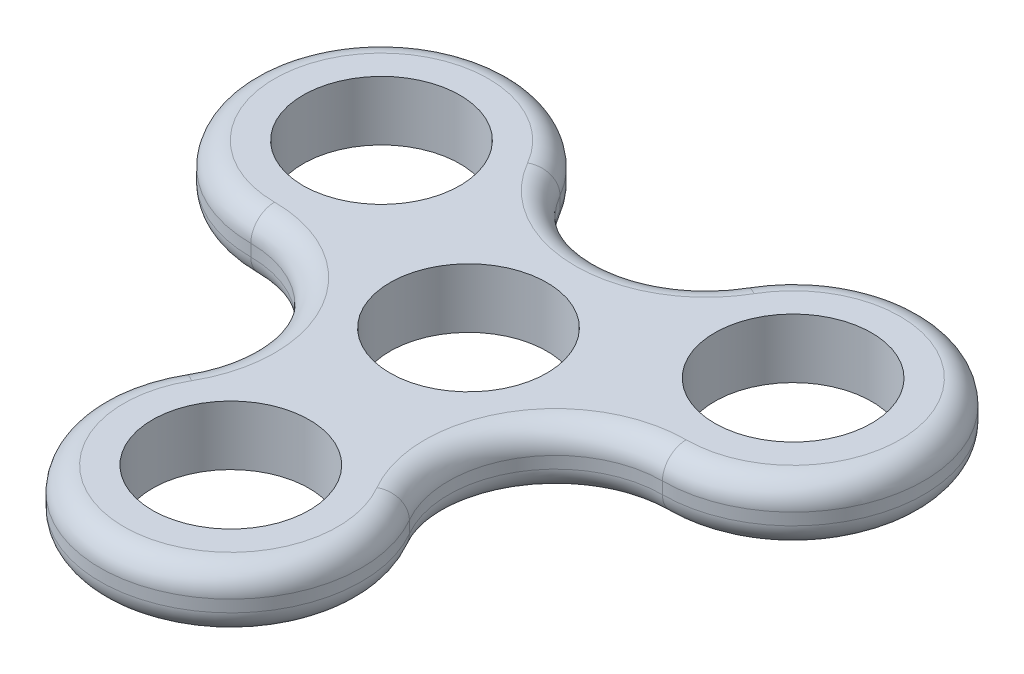
ISO-10303-21;
HEADER;
FILE_DESCRIPTION(('STEP AP214'),'2;1');
FILE_NAME('part.step','',(''),(''),'','','');
FILE_SCHEMA(('AUTOMOTIVE_DESIGN { 1 0 10303 214 1 1 1 1 }'));
ENDSEC;
DATA;
#1=APPLICATION_CONTEXT('core data for automotive mechanical design processes');
#2=APPLICATION_PROTOCOL_DEFINITION('international standard','automotive_design',2000,#1);
#3=PRODUCT_CONTEXT('',#1,'mechanical');
#4=PRODUCT('Part','Part','',(#3));
#5=PRODUCT_RELATED_PRODUCT_CATEGORY('part','',(#4));
#6=PRODUCT_DEFINITION_FORMATION('','',#4);
#7=PRODUCT_DEFINITION_CONTEXT('part definition',#1,'design');
#8=PRODUCT_DEFINITION('design','',#6,#7);
#9=PRODUCT_DEFINITION_SHAPE('','',#8);
#10=(LENGTH_UNIT() NAMED_UNIT(*) SI_UNIT(.MILLI.,.METRE.));
#11=(NAMED_UNIT(*) PLANE_ANGLE_UNIT() SI_UNIT($,.RADIAN.));
#12=(NAMED_UNIT(*) SI_UNIT($,.STERADIAN.) SOLID_ANGLE_UNIT());
#13=UNCERTAINTY_MEASURE_WITH_UNIT(LENGTH_MEASURE(1.E-05),#10,'distance_accuracy_value','');
#14=(GEOMETRIC_REPRESENTATION_CONTEXT(3) GLOBAL_UNCERTAINTY_ASSIGNED_CONTEXT((#13)) GLOBAL_UNIT_ASSIGNED_CONTEXT((#10,
#11,#12)) REPRESENTATION_CONTEXT('',''));
#15=CARTESIAN_POINT('',(0.,0.,0.));
#16=DIRECTION('',(0.,0.,1.));
#17=DIRECTION('',(1.,0.,0.));
#18=AXIS2_PLACEMENT_3D('',#15,#16,#17);
#19=CARTESIAN_POINT('',(8.66025403784441,5.,-15.));
#20=DIRECTION('',(0.,1.,0.));
#21=DIRECTION('',(0.,0.,1.));
#22=AXIS2_PLACEMENT_3D('',#19,#20,#21);
#23=PLANE('',#22);
#24=CARTESIAN_POINT('',(17.3205080756888,5.,9.99999999999995));
#25=DIRECTION('',(0.,1.,0.));
#26=DIRECTION('',(0.,0.,1.));
#27=AXIS2_PLACEMENT_3D('',#24,#25,#26);
#28=CIRCLE('',#27,10.9999999999999);
#29=CARTESIAN_POINT('',(7.79422863406009,5.,15.4999999999999));
#30=VERTEX_POINT('',#29);
#31=CARTESIAN_POINT('',(17.3205080756888,5.,-0.999999999999919));
#32=VERTEX_POINT('',#31);
#33=EDGE_CURVE('E149',#30,#32,#28,.F.);
#34=ORIENTED_EDGE('',*,*,#33,.T.);
#35=CARTESIAN_POINT('',(17.3205080756887,5.,-10.0000000000001));
#36=DIRECTION('',(0.,1.,0.));
#37=DIRECTION('',(0.,0.,1.));
#38=AXIS2_PLACEMENT_3D('',#35,#36,#37);
#39=CIRCLE('',#38,9.);
#40=CARTESIAN_POINT('',(9.5262794416289,5.,-14.5));
#41=VERTEX_POINT('',#40);
#42=EDGE_CURVE('E130',#32,#41,#39,.T.);
#43=ORIENTED_EDGE('',*,*,#42,.T.);
#44=CARTESIAN_POINT('',(0.,5.,-20.));
#45=DIRECTION('',(0.,1.,0.));
#46=DIRECTION('',(0.,0.,1.));
#47=AXIS2_PLACEMENT_3D('',#44,#45,#46);
#48=CIRCLE('',#47,11.);
#49=CARTESIAN_POINT('',(-9.52627944162872,5.,-14.5));
#50=VERTEX_POINT('',#49);
#51=EDGE_CURVE('E138',#41,#50,#48,.F.);
#52=ORIENTED_EDGE('',*,*,#51,.T.);
#53=CARTESIAN_POINT('',(-17.3205080756888,5.,-9.99999999999996));
#54=DIRECTION('',(0.,1.,0.));
#55=DIRECTION('',(0.,0.,1.));
#56=AXIS2_PLACEMENT_3D('',#53,#54,#55);
#57=CIRCLE('',#56,9.);
#58=CARTESIAN_POINT('',(-17.3205080756888,5.,-0.999999999999957));
#59=VERTEX_POINT('',#58);
#60=EDGE_CURVE('E144',#50,#59,#57,.T.);
#61=ORIENTED_EDGE('',*,*,#60,.T.);
#62=CARTESIAN_POINT('',(-17.3205080756887,5.,10.0000000000001));
#63=DIRECTION('',(0.,1.,0.));
#64=DIRECTION('',(0.,0.,1.));
#65=AXIS2_PLACEMENT_3D('',#62,#63,#64);
#66=CIRCLE('',#65,11.);
#67=CARTESIAN_POINT('',(-7.7942286340599,5.,15.5));
#68=VERTEX_POINT('',#67);
#69=EDGE_CURVE('E264',#59,#68,#66,.F.);
#70=ORIENTED_EDGE('',*,*,#69,.T.);
#71=CARTESIAN_POINT('',(0.,5.,20.));
#72=DIRECTION('',(0.,1.,0.));
#73=DIRECTION('',(0.,0.,1.));
#74=AXIS2_PLACEMENT_3D('',#71,#72,#73);
#75=CIRCLE('',#74,9.00000000000017);
#76=EDGE_CURVE('E155',#68,#30,#75,.T.);
#77=ORIENTED_EDGE('',*,*,#76,.T.);
#78=EDGE_LOOP('',(#34,#43,#52,#61,#70,#77));
#79=FACE_BOUND('',#78,.T.);
#80=CARTESIAN_POINT('',(17.3205080756887,5.,-10.0000000000001));
#81=DIRECTION('',(0.,1.,0.));
#82=DIRECTION('',(0.,0.,1.));
#83=AXIS2_PLACEMENT_3D('',#80,#81,#82);
#84=CIRCLE('',#83,6.6);
#85=CARTESIAN_POINT('',(17.3205080756887,5.,-3.40000000000009));
#86=VERTEX_POINT('',#85);
#87=EDGE_CURVE('E497',#86,#86,#84,.T.);
#88=ORIENTED_EDGE('',*,*,#87,.F.);
#89=EDGE_LOOP('',(#88));
#90=FACE_BOUND('',#89,.T.);
#91=CARTESIAN_POINT('',(0.,5.,0.));
#92=DIRECTION('',(0.,1.,0.));
#93=DIRECTION('',(0.,0.,1.));
#94=AXIS2_PLACEMENT_3D('',#91,#92,#93);
#95=CIRCLE('',#94,6.6);
#96=CARTESIAN_POINT('',(0.,5.,6.6));
#97=VERTEX_POINT('',#96);
#98=EDGE_CURVE('E245',#97,#97,#95,.T.);
#99=ORIENTED_EDGE('',*,*,#98,.F.);
#100=EDGE_LOOP('',(#99));
#101=FACE_BOUND('',#100,.T.);
#102=CARTESIAN_POINT('',(0.,5.,20.));
#103=DIRECTION('',(0.,1.,0.));
#104=DIRECTION('',(0.,0.,1.));
#105=AXIS2_PLACEMENT_3D('',#102,#103,#104);
#106=CIRCLE('',#105,6.6);
#107=CARTESIAN_POINT('',(0.,5.,26.6));
#108=VERTEX_POINT('',#107);
#109=EDGE_CURVE('E491',#108,#108,#106,.T.);
#110=ORIENTED_EDGE('',*,*,#109,.F.);
#111=EDGE_LOOP('',(#110));
#112=FACE_BOUND('',#111,.T.);
#113=CARTESIAN_POINT('',(-17.3205080756888,5.,-9.99999999999996));
#114=DIRECTION('',(0.,1.,0.));
#115=DIRECTION('',(0.,0.,1.));
#116=AXIS2_PLACEMENT_3D('',#113,#114,#115);
#117=CIRCLE('',#116,6.6);
#118=CARTESIAN_POINT('',(-17.3205080756888,5.,-3.39999999999996));
#119=VERTEX_POINT('',#118);
#120=EDGE_CURVE('E503',#119,#119,#117,.T.);
#121=ORIENTED_EDGE('',*,*,#120,.F.);
#122=EDGE_LOOP('',(#121));
#123=FACE_BOUND('',#122,.T.);
#124=ADVANCED_FACE('F33',(#79,#90,#101,#112,#123),#23,.T.);
#125=CARTESIAN_POINT('',(8.66025403784441,0.,-15.));
#126=DIRECTION('',(0.,1.,0.));
#127=DIRECTION('',(0.,0.,1.));
#128=AXIS2_PLACEMENT_3D('',#125,#126,#127);
#129=PLANE('',#128);
#130=CARTESIAN_POINT('',(0.,0.,-20.));
#131=DIRECTION('',(0.,1.,0.));
#132=DIRECTION('',(0.,0.,1.));
#133=AXIS2_PLACEMENT_3D('',#130,#131,#132);
#134=CIRCLE('',#133,11.);
#135=CARTESIAN_POINT('',(-9.52627944162872,0.,-14.5));
#136=VERTEX_POINT('',#135);
#137=CARTESIAN_POINT('',(9.5262794416289,0.,-14.5));
#138=VERTEX_POINT('',#137);
#139=EDGE_CURVE('E176',#136,#138,#134,.T.);
#140=ORIENTED_EDGE('',*,*,#139,.T.);
#141=CARTESIAN_POINT('',(17.3205080756887,0.,-10.0000000000001));
#142=DIRECTION('',(0.,1.,0.));
#143=DIRECTION('',(0.,0.,1.));
#144=AXIS2_PLACEMENT_3D('',#141,#142,#143);
#145=CIRCLE('',#144,9.);
#146=CARTESIAN_POINT('',(17.3205080756888,0.,-0.999999999999919));
#147=VERTEX_POINT('',#146);
#148=EDGE_CURVE('E185',#138,#147,#145,.F.);
#149=ORIENTED_EDGE('',*,*,#148,.T.);
#150=CARTESIAN_POINT('',(17.3205080756888,0.,9.99999999999995));
#151=DIRECTION('',(0.,1.,0.));
#152=DIRECTION('',(0.,0.,1.));
#153=AXIS2_PLACEMENT_3D('',#150,#151,#152);
#154=CIRCLE('',#153,10.9999999999999);
#155=CARTESIAN_POINT('',(7.79422863406009,0.,15.4999999999999));
#156=VERTEX_POINT('',#155);
#157=EDGE_CURVE('E57',#147,#156,#154,.T.);
#158=ORIENTED_EDGE('',*,*,#157,.T.);
#159=CARTESIAN_POINT('',(0.,0.,20.));
#160=DIRECTION('',(0.,1.,0.));
#161=DIRECTION('',(0.,0.,1.));
#162=AXIS2_PLACEMENT_3D('',#159,#160,#161);
#163=CIRCLE('',#162,9.00000000000017);
#164=CARTESIAN_POINT('',(-7.7942286340599,0.,15.5));
#165=VERTEX_POINT('',#164);
#166=EDGE_CURVE('E182',#156,#165,#163,.F.);
#167=ORIENTED_EDGE('',*,*,#166,.T.);
#168=CARTESIAN_POINT('',(-17.3205080756887,0.,10.0000000000001));
#169=DIRECTION('',(0.,1.,0.));
#170=DIRECTION('',(0.,0.,1.));
#171=AXIS2_PLACEMENT_3D('',#168,#169,#170);
#172=CIRCLE('',#171,11.);
#173=CARTESIAN_POINT('',(-17.3205080756888,0.,-0.999999999999957));
#174=VERTEX_POINT('',#173);
#175=EDGE_CURVE('E180',#165,#174,#172,.T.);
#176=ORIENTED_EDGE('',*,*,#175,.T.);
#177=CARTESIAN_POINT('',(-17.3205080756888,0.,-9.99999999999996));
#178=DIRECTION('',(0.,1.,0.));
#179=DIRECTION('',(0.,0.,1.));
#180=AXIS2_PLACEMENT_3D('',#177,#178,#179);
#181=CIRCLE('',#180,9.);
#182=EDGE_CURVE('E178',#174,#136,#181,.F.);
#183=ORIENTED_EDGE('',*,*,#182,.T.);
#184=EDGE_LOOP('',(#140,#149,#158,#167,#176,#183));
#185=FACE_BOUND('',#184,.T.);
#186=CARTESIAN_POINT('',(0.,0.,0.));
#187=DIRECTION('',(0.,1.,0.));
#188=DIRECTION('',(0.,0.,1.));
#189=AXIS2_PLACEMENT_3D('',#186,#187,#188);
#190=CIRCLE('',#189,6.6);
#191=CARTESIAN_POINT('',(0.,0.,6.6));
#192=VERTEX_POINT('',#191);
#193=EDGE_CURVE('E250',#192,#192,#190,.T.);
#194=ORIENTED_EDGE('',*,*,#193,.T.);
#195=EDGE_LOOP('',(#194));
#196=FACE_BOUND('',#195,.T.);
#197=CARTESIAN_POINT('',(0.,0.,20.));
#198=DIRECTION('',(0.,1.,0.));
#199=DIRECTION('',(0.,0.,1.));
#200=AXIS2_PLACEMENT_3D('',#197,#198,#199);
#201=CIRCLE('',#200,6.6);
#202=CARTESIAN_POINT('',(0.,0.,26.6));
#203=VERTEX_POINT('',#202);
#204=EDGE_CURVE('E493',#203,#203,#201,.T.);
#205=ORIENTED_EDGE('',*,*,#204,.T.);
#206=EDGE_LOOP('',(#205));
#207=FACE_BOUND('',#206,.T.);
#208=CARTESIAN_POINT('',(17.3205080756887,0.,-10.0000000000001));
#209=DIRECTION('',(0.,1.,0.));
#210=DIRECTION('',(0.,0.,1.));
#211=AXIS2_PLACEMENT_3D('',#208,#209,#210);
#212=CIRCLE('',#211,6.6);
#213=CARTESIAN_POINT('',(17.3205080756887,0.,-3.40000000000009));
#214=VERTEX_POINT('',#213);
#215=EDGE_CURVE('E500',#214,#214,#212,.T.);
#216=ORIENTED_EDGE('',*,*,#215,.T.);
#217=EDGE_LOOP('',(#216));
#218=FACE_BOUND('',#217,.T.);
#219=CARTESIAN_POINT('',(-17.3205080756888,0.,-9.99999999999996));
#220=DIRECTION('',(0.,1.,0.));
#221=DIRECTION('',(0.,0.,1.));
#222=AXIS2_PLACEMENT_3D('',#219,#220,#221);
#223=CIRCLE('',#222,6.6);
#224=CARTESIAN_POINT('',(-17.3205080756888,0.,-3.39999999999996));
#225=VERTEX_POINT('',#224);
#226=EDGE_CURVE('E199',#225,#225,#223,.T.);
#227=ORIENTED_EDGE('',*,*,#226,.T.);
#228=EDGE_LOOP('',(#227));
#229=FACE_BOUND('',#228,.T.);
#230=ADVANCED_FACE('F223',(#185,#196,#207,#218,#229),#129,.F.);
#231=CARTESIAN_POINT('',(0.,5.,-20.));
#232=DIRECTION('',(0.,-1.,0.));
#233=DIRECTION('',(0.,0.,-1.));
#234=AXIS2_PLACEMENT_3D('',#231,#232,#233);
#235=CYLINDRICAL_SURFACE('',#234,8.99999999999998);
#236=DIRECTION('',(0.,-1.,0.));
#237=VECTOR('',#236,1.);
#238=CARTESIAN_POINT('',(-7.79422863405997,5.,-15.4999999999999));
#239=LINE('',#238,#237);
#240=CARTESIAN_POINT('',(-7.79422863405997,3.,-15.4999999999999));
#241=VERTEX_POINT('',#240);
#242=CARTESIAN_POINT('',(-7.79422863405997,2.,-15.4999999999999));
#243=VERTEX_POINT('',#242);
#244=EDGE_CURVE('E145',#241,#243,#239,.T.);
#245=ORIENTED_EDGE('',*,*,#244,.F.);
#246=CARTESIAN_POINT('',(0.,3.,-20.));
#247=DIRECTION('',(0.,1.,0.));
#248=DIRECTION('',(0.,0.,1.));
#249=AXIS2_PLACEMENT_3D('',#246,#247,#248);
#250=CIRCLE('',#249,8.99999999999998);
#251=CARTESIAN_POINT('',(7.79422863405989,3.,-15.5000000000001));
#252=VERTEX_POINT('',#251);
#253=EDGE_CURVE('E11',#241,#252,#250,.T.);
#254=ORIENTED_EDGE('',*,*,#253,.T.);
#255=DIRECTION('',(0.,-1.,0.));
#256=VECTOR('',#255,1.);
#257=CARTESIAN_POINT('',(7.79422863405989,5.,-15.5000000000001));
#258=LINE('',#257,#256);
#259=CARTESIAN_POINT('',(7.79422863405989,2.,-15.5000000000001));
#260=VERTEX_POINT('',#259);
#261=EDGE_CURVE('E238',#252,#260,#258,.T.);
#262=ORIENTED_EDGE('',*,*,#261,.T.);
#263=CARTESIAN_POINT('',(0.,2.,-20.));
#264=DIRECTION('',(0.,1.,0.));
#265=DIRECTION('',(0.,0.,1.));
#266=AXIS2_PLACEMENT_3D('',#263,#264,#265);
#267=CIRCLE('',#266,8.99999999999998);
#268=EDGE_CURVE('E42',#260,#243,#267,.F.);
#269=ORIENTED_EDGE('',*,*,#268,.T.);
#270=EDGE_LOOP('',(#245,#254,#262,#269));
#271=FACE_BOUND('',#270,.T.);
#272=ADVANCED_FACE('F243',(#271),#235,.F.);
#273=CARTESIAN_POINT('',(-17.3205080756888,5.,-9.99999999999996));
#274=DIRECTION('',(0.,-1.,0.));
#275=DIRECTION('',(0.,0.,-1.));
#276=AXIS2_PLACEMENT_3D('',#273,#274,#275);
#277=CYLINDRICAL_SURFACE('',#276,11.);
#278=DIRECTION('',(0.,-1.,0.));
#279=VECTOR('',#278,1.);
#280=CARTESIAN_POINT('',(-17.3205080756888,5.,1.00000000000004));
#281=LINE('',#280,#279);
#282=CARTESIAN_POINT('',(-17.3205080756888,3.,1.00000000000004));
#283=VERTEX_POINT('',#282);
#284=CARTESIAN_POINT('',(-17.3205080756888,2.,1.00000000000004));
#285=VERTEX_POINT('',#284);
#286=EDGE_CURVE('E259',#283,#285,#281,.T.);
#287=ORIENTED_EDGE('',*,*,#286,.F.);
#288=CARTESIAN_POINT('',(-17.3205080756888,3.,-9.99999999999996));
#289=DIRECTION('',(0.,1.,0.));
#290=DIRECTION('',(0.,0.,1.));
#291=AXIS2_PLACEMENT_3D('',#288,#289,#290);
#292=CIRCLE('',#291,11.);
#293=EDGE_CURVE('E174',#283,#241,#292,.F.);
#294=ORIENTED_EDGE('',*,*,#293,.T.);
#295=ORIENTED_EDGE('',*,*,#244,.T.);
#296=CARTESIAN_POINT('',(-17.3205080756888,2.,-9.99999999999996));
#297=DIRECTION('',(0.,1.,0.));
#298=DIRECTION('',(0.,0.,1.));
#299=AXIS2_PLACEMENT_3D('',#296,#297,#298);
#300=CIRCLE('',#299,11.);
#301=EDGE_CURVE('E172',#243,#285,#300,.T.);
#302=ORIENTED_EDGE('',*,*,#301,.T.);
#303=EDGE_LOOP('',(#287,#294,#295,#302));
#304=FACE_BOUND('',#303,.T.);
#305=ADVANCED_FACE('F310',(#304),#277,.T.);
#306=CARTESIAN_POINT('',(-17.3205080756887,5.,10.0000000000001));
#307=DIRECTION('',(0.,-1.,0.));
#308=DIRECTION('',(0.,0.,-1.));
#309=AXIS2_PLACEMENT_3D('',#306,#307,#308);
#310=CYLINDRICAL_SURFACE('',#309,8.99999999999998);
#311=DIRECTION('',(0.,-1.,0.));
#312=VECTOR('',#311,1.);
#313=CARTESIAN_POINT('',(-9.52627944162878,5.,14.5000000000001));
#314=LINE('',#313,#312);
#315=CARTESIAN_POINT('',(-9.52627944162878,3.,14.5000000000001));
#316=VERTEX_POINT('',#315);
#317=CARTESIAN_POINT('',(-9.52627944162878,2.,14.5000000000001));
#318=VERTEX_POINT('',#317);
#319=EDGE_CURVE('E256',#316,#318,#314,.T.);
#320=ORIENTED_EDGE('',*,*,#319,.F.);
#321=CARTESIAN_POINT('',(-17.3205080756887,3.,10.0000000000001));
#322=DIRECTION('',(0.,1.,0.));
#323=DIRECTION('',(0.,0.,1.));
#324=AXIS2_PLACEMENT_3D('',#321,#322,#323);
#325=CIRCLE('',#324,8.99999999999998);
#326=EDGE_CURVE('E170',#316,#283,#325,.T.);
#327=ORIENTED_EDGE('',*,*,#326,.T.);
#328=ORIENTED_EDGE('',*,*,#286,.T.);
#329=CARTESIAN_POINT('',(-17.3205080756887,2.,10.0000000000001));
#330=DIRECTION('',(0.,1.,0.));
#331=DIRECTION('',(0.,0.,1.));
#332=AXIS2_PLACEMENT_3D('',#329,#330,#331);
#333=CIRCLE('',#332,8.99999999999998);
#334=EDGE_CURVE('E168',#285,#318,#333,.F.);
#335=ORIENTED_EDGE('',*,*,#334,.T.);
#336=EDGE_LOOP('',(#320,#327,#328,#335));
#337=FACE_BOUND('',#336,.T.);
#338=ADVANCED_FACE('F306',(#337),#310,.F.);
#339=CARTESIAN_POINT('',(0.,5.,20.));
#340=DIRECTION('',(0.,-1.,0.));
#341=DIRECTION('',(0.,0.,-1.));
#342=AXIS2_PLACEMENT_3D('',#339,#340,#341);
#343=CYLINDRICAL_SURFACE('',#342,11.0000000000002);
#344=DIRECTION('',(0.,-1.,0.));
#345=VECTOR('',#344,1.);
#346=CARTESIAN_POINT('',(9.52627944162897,5.,14.4999999999999));
#347=LINE('',#346,#345);
#348=CARTESIAN_POINT('',(9.52627944162897,3.,14.4999999999999));
#349=VERTEX_POINT('',#348);
#350=CARTESIAN_POINT('',(9.52627944162897,2.,14.4999999999999));
#351=VERTEX_POINT('',#350);
#352=EDGE_CURVE('E247',#349,#351,#347,.T.);
#353=ORIENTED_EDGE('',*,*,#352,.F.);
#354=CARTESIAN_POINT('',(0.,3.,20.));
#355=DIRECTION('',(0.,1.,0.));
#356=DIRECTION('',(0.,0.,1.));
#357=AXIS2_PLACEMENT_3D('',#354,#355,#356);
#358=CIRCLE('',#357,11.0000000000002);
#359=EDGE_CURVE('E166',#349,#316,#358,.F.);
#360=ORIENTED_EDGE('',*,*,#359,.T.);
#361=ORIENTED_EDGE('',*,*,#319,.T.);
#362=CARTESIAN_POINT('',(0.,2.,20.));
#363=DIRECTION('',(0.,1.,0.));
#364=DIRECTION('',(0.,0.,1.));
#365=AXIS2_PLACEMENT_3D('',#362,#363,#364);
#366=CIRCLE('',#365,11.0000000000002);
#367=EDGE_CURVE('E164',#318,#351,#366,.T.);
#368=ORIENTED_EDGE('',*,*,#367,.T.);
#369=EDGE_LOOP('',(#353,#360,#361,#368));
#370=FACE_BOUND('',#369,.T.);
#371=ADVANCED_FACE('F303',(#370),#343,.T.);
#372=CARTESIAN_POINT('',(17.3205080756888,5.,9.99999999999995));
#373=DIRECTION('',(0.,-1.,0.));
#374=DIRECTION('',(0.,0.,-1.));
#375=AXIS2_PLACEMENT_3D('',#372,#373,#374);
#376=CYLINDRICAL_SURFACE('',#375,8.99999999999987);
#377=DIRECTION('',(0.,-1.,0.));
#378=VECTOR('',#377,1.);
#379=CARTESIAN_POINT('',(17.3205080756888,5.,1.00000000000008));
#380=LINE('',#379,#378);
#381=CARTESIAN_POINT('',(17.3205080756888,3.,1.00000000000008));
#382=VERTEX_POINT('',#381);
#383=CARTESIAN_POINT('',(17.3205080756888,2.,1.00000000000008));
#384=VERTEX_POINT('',#383);
#385=EDGE_CURVE('E240',#382,#384,#380,.T.);
#386=ORIENTED_EDGE('',*,*,#385,.F.);
#387=CARTESIAN_POINT('',(17.3205080756888,3.,9.99999999999995));
#388=DIRECTION('',(0.,1.,0.));
#389=DIRECTION('',(0.,0.,1.));
#390=AXIS2_PLACEMENT_3D('',#387,#388,#389);
#391=CIRCLE('',#390,8.99999999999987);
#392=EDGE_CURVE('E162',#382,#349,#391,.T.);
#393=ORIENTED_EDGE('',*,*,#392,.T.);
#394=ORIENTED_EDGE('',*,*,#352,.T.);
#395=CARTESIAN_POINT('',(17.3205080756888,2.,9.99999999999995));
#396=DIRECTION('',(0.,1.,0.));
#397=DIRECTION('',(0.,0.,1.));
#398=AXIS2_PLACEMENT_3D('',#395,#396,#397);
#399=CIRCLE('',#398,8.99999999999987);
#400=EDGE_CURVE('E160',#351,#384,#399,.F.);
#401=ORIENTED_EDGE('',*,*,#400,.T.);
#402=EDGE_LOOP('',(#386,#393,#394,#401));
#403=FACE_BOUND('',#402,.T.);
#404=ADVANCED_FACE('F277',(#403),#376,.F.);
#405=CARTESIAN_POINT('',(17.3205080756887,5.,-10.0000000000001));
#406=DIRECTION('',(0.,-1.,0.));
#407=DIRECTION('',(0.,0.,-1.));
#408=AXIS2_PLACEMENT_3D('',#405,#406,#407);
#409=CYLINDRICAL_SURFACE('',#408,11.);
#410=ORIENTED_EDGE('',*,*,#261,.F.);
#411=CARTESIAN_POINT('',(17.3205080756887,3.,-10.0000000000001));
#412=DIRECTION('',(0.,1.,0.));
#413=DIRECTION('',(0.,0.,1.));
#414=AXIS2_PLACEMENT_3D('',#411,#412,#413);
#415=CIRCLE('',#414,11.);
#416=EDGE_CURVE('E132',#252,#382,#415,.F.);
#417=ORIENTED_EDGE('',*,*,#416,.T.);
#418=ORIENTED_EDGE('',*,*,#385,.T.);
#419=CARTESIAN_POINT('',(17.3205080756887,2.,-10.0000000000001));
#420=DIRECTION('',(0.,1.,0.));
#421=DIRECTION('',(0.,0.,1.));
#422=AXIS2_PLACEMENT_3D('',#419,#420,#421);
#423=CIRCLE('',#422,11.);
#424=EDGE_CURVE('E151',#384,#260,#423,.T.);
#425=ORIENTED_EDGE('',*,*,#424,.T.);
#426=EDGE_LOOP('',(#410,#417,#418,#425));
#427=FACE_BOUND('',#426,.T.);
#428=ADVANCED_FACE('F237',(#427),#409,.T.);
#429=CARTESIAN_POINT('',(0.,5.,0.));
#430=DIRECTION('',(0.,-1.,0.));
#431=DIRECTION('',(0.,0.,-1.));
#432=AXIS2_PLACEMENT_3D('',#429,#430,#431);
#433=CYLINDRICAL_SURFACE('',#432,6.6);
#434=ORIENTED_EDGE('',*,*,#98,.T.);
#435=EDGE_LOOP('',(#434));
#436=FACE_BOUND('',#435,.T.);
#437=ORIENTED_EDGE('',*,*,#193,.F.);
#438=EDGE_LOOP('',(#437));
#439=FACE_BOUND('',#438,.T.);
#440=ADVANCED_FACE('F296',(#436,#439),#433,.F.);
#441=CARTESIAN_POINT('',(0.,5.,20.));
#442=DIRECTION('',(0.,-1.,0.));
#443=DIRECTION('',(0.,0.,-1.));
#444=AXIS2_PLACEMENT_3D('',#441,#442,#443);
#445=CYLINDRICAL_SURFACE('',#444,6.6);
#446=ORIENTED_EDGE('',*,*,#109,.T.);
#447=EDGE_LOOP('',(#446));
#448=FACE_BOUND('',#447,.T.);
#449=ORIENTED_EDGE('',*,*,#204,.F.);
#450=EDGE_LOOP('',(#449));
#451=FACE_BOUND('',#450,.T.);
#452=ADVANCED_FACE('F468',(#448,#451),#445,.F.);
#453=CARTESIAN_POINT('',(17.3205080756887,5.,-10.0000000000001));
#454=DIRECTION('',(0.,-1.,0.));
#455=DIRECTION('',(0.,0.,-1.));
#456=AXIS2_PLACEMENT_3D('',#453,#454,#455);
#457=CYLINDRICAL_SURFACE('',#456,6.6);
#458=ORIENTED_EDGE('',*,*,#87,.T.);
#459=EDGE_LOOP('',(#458));
#460=FACE_BOUND('',#459,.T.);
#461=ORIENTED_EDGE('',*,*,#215,.F.);
#462=EDGE_LOOP('',(#461));
#463=FACE_BOUND('',#462,.T.);
#464=ADVANCED_FACE('F458',(#460,#463),#457,.F.);
#465=CARTESIAN_POINT('',(-17.3205080756888,5.,-9.99999999999996));
#466=DIRECTION('',(0.,-1.,0.));
#467=DIRECTION('',(0.,0.,-1.));
#468=AXIS2_PLACEMENT_3D('',#465,#466,#467);
#469=CYLINDRICAL_SURFACE('',#468,6.6);
#470=ORIENTED_EDGE('',*,*,#120,.T.);
#471=EDGE_LOOP('',(#470));
#472=FACE_BOUND('',#471,.T.);
#473=ORIENTED_EDGE('',*,*,#226,.F.);
#474=EDGE_LOOP('',(#473));
#475=FACE_BOUND('',#474,.T.);
#476=ADVANCED_FACE('F332',(#472,#475),#469,.F.);
#477=CARTESIAN_POINT('',(-17.3205080756887,3.,10.0000000000001));
#478=DIRECTION('',(0.,1.,0.));
#479=DIRECTION('',(0.,0.,1.));
#480=AXIS2_PLACEMENT_3D('',#477,#478,#479);
#481=TOROIDAL_SURFACE('',#480,11.,2.);
#482=CARTESIAN_POINT('',(-17.3205080756888,3.,-0.999999999999895));
#483=DIRECTION('',(-1.,0.,0.));
#484=DIRECTION('',(0.,0.,1.));
#485=AXIS2_PLACEMENT_3D('',#482,#483,#484);
#486=CIRCLE('',#485,2.);
#487=EDGE_CURVE('E193',#283,#59,#486,.T.);
#488=ORIENTED_EDGE('',*,*,#487,.F.);
#489=ORIENTED_EDGE('',*,*,#326,.F.);
#490=CARTESIAN_POINT('',(-7.7942286340599,3.,15.5));
#491=DIRECTION('',(-0.499999999999998,0.,0.86602540378444));
#492=DIRECTION('',(0.86602540378444,0.,0.499999999999998));
#493=AXIS2_PLACEMENT_3D('',#490,#491,#492);
#494=CIRCLE('',#493,2.);
#495=EDGE_CURVE('E196',#68,#316,#494,.T.);
#496=ORIENTED_EDGE('',*,*,#495,.F.);
#497=ORIENTED_EDGE('',*,*,#69,.F.);
#498=EDGE_LOOP('',(#488,#489,#496,#497));
#499=FACE_BOUND('',#498,.T.);
#500=ADVANCED_FACE('F329',(#499),#481,.T.);
#501=CARTESIAN_POINT('',(0.,3.,20.));
#502=DIRECTION('',(0.,1.,0.));
#503=DIRECTION('',(0.,0.,1.));
#504=AXIS2_PLACEMENT_3D('',#501,#502,#503);
#505=TOROIDAL_SURFACE('',#504,9.00000000000017,2.);
#506=ORIENTED_EDGE('',*,*,#495,.T.);
#507=ORIENTED_EDGE('',*,*,#359,.F.);
#508=CARTESIAN_POINT('',(7.79422863406009,3.,15.4999999999999));
#509=DIRECTION('',(-0.500000000000001,0.,-0.866025403784438));
#510=DIRECTION('',(-0.866025403784438,0.,0.500000000000001));
#511=AXIS2_PLACEMENT_3D('',#508,#509,#510);
#512=CIRCLE('',#511,2.);
#513=EDGE_CURVE('E190',#30,#349,#512,.T.);
#514=ORIENTED_EDGE('',*,*,#513,.F.);
#515=ORIENTED_EDGE('',*,*,#76,.F.);
#516=EDGE_LOOP('',(#506,#507,#514,#515));
#517=FACE_BOUND('',#516,.T.);
#518=ADVANCED_FACE('F271',(#517),#505,.T.);
#519=CARTESIAN_POINT('',(-17.3205080756888,3.,-9.99999999999996));
#520=DIRECTION('',(0.,1.,0.));
#521=DIRECTION('',(0.,0.,1.));
#522=AXIS2_PLACEMENT_3D('',#519,#520,#521);
#523=TOROIDAL_SURFACE('',#522,9.,2.);
#524=ORIENTED_EDGE('',*,*,#487,.T.);
#525=ORIENTED_EDGE('',*,*,#60,.F.);
#526=CARTESIAN_POINT('',(-9.52627944162884,3.,-14.4999999999999));
#527=DIRECTION('',(0.499999999999999,0.,0.866025403784439));
#528=DIRECTION('',(0.866025403784439,0.,-0.499999999999999));
#529=AXIS2_PLACEMENT_3D('',#526,#527,#528);
#530=CIRCLE('',#529,2.);
#531=EDGE_CURVE('E141',#241,#50,#530,.T.);
#532=ORIENTED_EDGE('',*,*,#531,.F.);
#533=ORIENTED_EDGE('',*,*,#293,.F.);
#534=EDGE_LOOP('',(#524,#525,#532,#533));
#535=FACE_BOUND('',#534,.T.);
#536=ADVANCED_FACE('F323',(#535),#523,.T.);
#537=CARTESIAN_POINT('',(17.3205080756888,3.,9.99999999999995));
#538=DIRECTION('',(0.,1.,0.));
#539=DIRECTION('',(0.,0.,1.));
#540=AXIS2_PLACEMENT_3D('',#537,#538,#539);
#541=TOROIDAL_SURFACE('',#540,10.9999999999999,2.);
#542=ORIENTED_EDGE('',*,*,#513,.T.);
#543=ORIENTED_EDGE('',*,*,#392,.F.);
#544=CARTESIAN_POINT('',(17.3205080756888,3.,-0.999999999999919));
#545=DIRECTION('',(1.,0.,0.));
#546=DIRECTION('',(0.,0.,-1.));
#547=AXIS2_PLACEMENT_3D('',#544,#545,#546);
#548=CIRCLE('',#547,2.);
#549=EDGE_CURVE('E135',#32,#382,#548,.T.);
#550=ORIENTED_EDGE('',*,*,#549,.F.);
#551=ORIENTED_EDGE('',*,*,#33,.F.);
#552=EDGE_LOOP('',(#542,#543,#550,#551));
#553=FACE_BOUND('',#552,.T.);
#554=ADVANCED_FACE('F274',(#553),#541,.T.);
#555=CARTESIAN_POINT('',(0.,3.,-20.));
#556=DIRECTION('',(0.,1.,0.));
#557=DIRECTION('',(0.,0.,1.));
#558=AXIS2_PLACEMENT_3D('',#555,#556,#557);
#559=TOROIDAL_SURFACE('',#558,11.,2.);
#560=ORIENTED_EDGE('',*,*,#531,.T.);
#561=ORIENTED_EDGE('',*,*,#51,.F.);
#562=CARTESIAN_POINT('',(9.5262794416289,3.,-14.5));
#563=DIRECTION('',(0.5,0.,-0.866025403784438));
#564=DIRECTION('',(-0.866025403784438,0.,-0.5));
#565=AXIS2_PLACEMENT_3D('',#562,#563,#564);
#566=CIRCLE('',#565,2.);
#567=EDGE_CURVE('E126',#252,#41,#566,.T.);
#568=ORIENTED_EDGE('',*,*,#567,.F.);
#569=ORIENTED_EDGE('',*,*,#253,.F.);
#570=EDGE_LOOP('',(#560,#561,#568,#569));
#571=FACE_BOUND('',#570,.T.);
#572=ADVANCED_FACE('F139',(#571),#559,.T.);
#573=CARTESIAN_POINT('',(17.3205080756887,3.,-10.0000000000001));
#574=DIRECTION('',(0.,1.,0.));
#575=DIRECTION('',(0.,0.,1.));
#576=AXIS2_PLACEMENT_3D('',#573,#574,#575);
#577=TOROIDAL_SURFACE('',#576,9.,2.);
#578=ORIENTED_EDGE('',*,*,#549,.T.);
#579=ORIENTED_EDGE('',*,*,#416,.F.);
#580=ORIENTED_EDGE('',*,*,#567,.T.);
#581=ORIENTED_EDGE('',*,*,#42,.F.);
#582=EDGE_LOOP('',(#578,#579,#580,#581));
#583=FACE_BOUND('',#582,.T.);
#584=ADVANCED_FACE('F128',(#583),#577,.T.);
#585=CARTESIAN_POINT('',(-17.3205080756887,2.,10.0000000000001));
#586=DIRECTION('',(0.,1.,0.));
#587=DIRECTION('',(0.,0.,1.));
#588=AXIS2_PLACEMENT_3D('',#585,#586,#587);
#589=TOROIDAL_SURFACE('',#588,11.,2.);
#590=CARTESIAN_POINT('',(-17.3205080756888,2.,-0.999999999999895));
#591=DIRECTION('',(-1.,0.,0.));
#592=DIRECTION('',(0.,0.,1.));
#593=AXIS2_PLACEMENT_3D('',#590,#591,#592);
#594=CIRCLE('',#593,2.);
#595=EDGE_CURVE('E208',#174,#285,#594,.T.);
#596=ORIENTED_EDGE('',*,*,#595,.F.);
#597=ORIENTED_EDGE('',*,*,#175,.F.);
#598=CARTESIAN_POINT('',(-7.7942286340599,2.,15.5));
#599=DIRECTION('',(-0.499999999999998,0.,0.86602540378444));
#600=DIRECTION('',(0.86602540378444,0.,0.499999999999998));
#601=AXIS2_PLACEMENT_3D('',#598,#599,#600);
#602=CIRCLE('',#601,2.);
#603=EDGE_CURVE('E37',#318,#165,#602,.T.);
#604=ORIENTED_EDGE('',*,*,#603,.F.);
#605=ORIENTED_EDGE('',*,*,#334,.F.);
#606=EDGE_LOOP('',(#596,#597,#604,#605));
#607=FACE_BOUND('',#606,.T.);
#608=ADVANCED_FACE('F35',(#607),#589,.T.);
#609=CARTESIAN_POINT('',(0.,2.,20.));
#610=DIRECTION('',(0.,1.,0.));
#611=DIRECTION('',(0.,0.,1.));
#612=AXIS2_PLACEMENT_3D('',#609,#610,#611);
#613=TOROIDAL_SURFACE('',#612,9.00000000000017,2.);
#614=ORIENTED_EDGE('',*,*,#603,.T.);
#615=ORIENTED_EDGE('',*,*,#166,.F.);
#616=CARTESIAN_POINT('',(7.79422863406009,2.,15.4999999999999));
#617=DIRECTION('',(-0.500000000000001,0.,-0.866025403784438));
#618=DIRECTION('',(-0.866025403784438,0.,0.500000000000001));
#619=AXIS2_PLACEMENT_3D('',#616,#617,#618);
#620=CIRCLE('',#619,2.);
#621=EDGE_CURVE('E206',#351,#156,#620,.T.);
#622=ORIENTED_EDGE('',*,*,#621,.F.);
#623=ORIENTED_EDGE('',*,*,#367,.F.);
#624=EDGE_LOOP('',(#614,#615,#622,#623));
#625=FACE_BOUND('',#624,.T.);
#626=ADVANCED_FACE('F218',(#625),#613,.T.);
#627=CARTESIAN_POINT('',(-17.3205080756888,2.,-9.99999999999996));
#628=DIRECTION('',(0.,1.,0.));
#629=DIRECTION('',(0.,0.,1.));
#630=AXIS2_PLACEMENT_3D('',#627,#628,#629);
#631=TOROIDAL_SURFACE('',#630,9.,2.);
#632=ORIENTED_EDGE('',*,*,#595,.T.);
#633=ORIENTED_EDGE('',*,*,#301,.F.);
#634=CARTESIAN_POINT('',(-9.52627944162884,2.,-14.4999999999999));
#635=DIRECTION('',(0.499999999999999,0.,0.866025403784439));
#636=DIRECTION('',(0.866025403784439,0.,-0.499999999999999));
#637=AXIS2_PLACEMENT_3D('',#634,#635,#636);
#638=CIRCLE('',#637,2.);
#639=EDGE_CURVE('E203',#136,#243,#638,.T.);
#640=ORIENTED_EDGE('',*,*,#639,.F.);
#641=ORIENTED_EDGE('',*,*,#182,.F.);
#642=EDGE_LOOP('',(#632,#633,#640,#641));
#643=FACE_BOUND('',#642,.T.);
#644=ADVANCED_FACE('F227',(#643),#631,.T.);
#645=CARTESIAN_POINT('',(17.3205080756888,2.,9.99999999999995));
#646=DIRECTION('',(0.,1.,0.));
#647=DIRECTION('',(0.,0.,1.));
#648=AXIS2_PLACEMENT_3D('',#645,#646,#647);
#649=TOROIDAL_SURFACE('',#648,10.9999999999999,2.);
#650=ORIENTED_EDGE('',*,*,#621,.T.);
#651=ORIENTED_EDGE('',*,*,#157,.F.);
#652=CARTESIAN_POINT('',(17.3205080756888,2.,-0.999999999999919));
#653=DIRECTION('',(1.,0.,0.));
#654=DIRECTION('',(0.,0.,-1.));
#655=AXIS2_PLACEMENT_3D('',#652,#653,#654);
#656=CIRCLE('',#655,2.);
#657=EDGE_CURVE('E50',#384,#147,#656,.T.);
#658=ORIENTED_EDGE('',*,*,#657,.F.);
#659=ORIENTED_EDGE('',*,*,#400,.F.);
#660=EDGE_LOOP('',(#650,#651,#658,#659));
#661=FACE_BOUND('',#660,.T.);
#662=ADVANCED_FACE('F280',(#661),#649,.T.);
#663=CARTESIAN_POINT('',(0.,2.,-20.));
#664=DIRECTION('',(0.,1.,0.));
#665=DIRECTION('',(0.,0.,1.));
#666=AXIS2_PLACEMENT_3D('',#663,#664,#665);
#667=TOROIDAL_SURFACE('',#666,11.,2.);
#668=ORIENTED_EDGE('',*,*,#639,.T.);
#669=ORIENTED_EDGE('',*,*,#268,.F.);
#670=CARTESIAN_POINT('',(9.5262794416289,2.,-14.5));
#671=DIRECTION('',(0.499999999999999,0.,-0.866025403784439));
#672=DIRECTION('',(-0.866025403784439,0.,-0.499999999999999));
#673=AXIS2_PLACEMENT_3D('',#670,#671,#672);
#674=CIRCLE('',#673,2.);
#675=EDGE_CURVE('E200',#138,#260,#674,.T.);
#676=ORIENTED_EDGE('',*,*,#675,.F.);
#677=ORIENTED_EDGE('',*,*,#139,.F.);
#678=EDGE_LOOP('',(#668,#669,#676,#677));
#679=FACE_BOUND('',#678,.T.);
#680=ADVANCED_FACE('F231',(#679),#667,.T.);
#681=CARTESIAN_POINT('',(17.3205080756887,2.,-10.0000000000001));
#682=DIRECTION('',(0.,1.,0.));
#683=DIRECTION('',(0.,0.,1.));
#684=AXIS2_PLACEMENT_3D('',#681,#682,#683);
#685=TOROIDAL_SURFACE('',#684,9.,2.);
#686=ORIENTED_EDGE('',*,*,#657,.T.);
#687=ORIENTED_EDGE('',*,*,#148,.F.);
#688=ORIENTED_EDGE('',*,*,#675,.T.);
#689=ORIENTED_EDGE('',*,*,#424,.F.);
#690=EDGE_LOOP('',(#686,#687,#688,#689));
#691=FACE_BOUND('',#690,.T.);
#692=ADVANCED_FACE('F232',(#691),#685,.T.);
#693=CLOSED_SHELL('',(#124,#230,#272,#305,#338,#371,#404,#428,#440,#452,#464,#476,#500,#518,
#536,#554,#572,#584,#608,#626,#644,#662,#680,#692));
#694=MANIFOLD_SOLID_BREP('B2',#693);
#695=ADVANCED_BREP_SHAPE_REPRESENTATION('',(#18,#694),#14);
#696=SHAPE_DEFINITION_REPRESENTATION(#9,#695);
ENDSEC;
END-ISO-10303-21;
